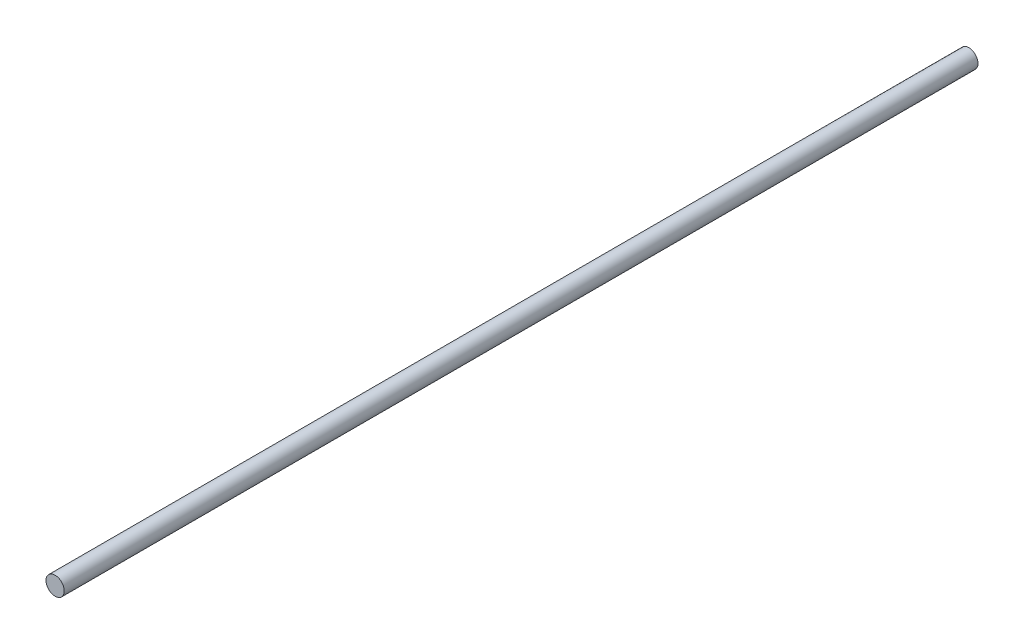
ISO-10303-21;
HEADER;
FILE_DESCRIPTION(('STEP AP214'),'2;1');
FILE_NAME('part.step','',(''),(''),'','','');
FILE_SCHEMA(('AUTOMOTIVE_DESIGN { 1 0 10303 214 1 1 1 1 }'));
ENDSEC;
DATA;
#1=APPLICATION_CONTEXT('core data for automotive mechanical design processes');
#2=APPLICATION_PROTOCOL_DEFINITION('international standard','automotive_design',2000,#1);
#3=PRODUCT_CONTEXT('',#1,'mechanical');
#4=PRODUCT('Part','Part','',(#3));
#5=PRODUCT_RELATED_PRODUCT_CATEGORY('part','',(#4));
#6=PRODUCT_DEFINITION_FORMATION('','',#4);
#7=PRODUCT_DEFINITION_CONTEXT('part definition',#1,'design');
#8=PRODUCT_DEFINITION('design','',#6,#7);
#9=PRODUCT_DEFINITION_SHAPE('','',#8);
#10=(LENGTH_UNIT() NAMED_UNIT(*) SI_UNIT(.MILLI.,.METRE.));
#11=(NAMED_UNIT(*) PLANE_ANGLE_UNIT() SI_UNIT($,.RADIAN.));
#12=(NAMED_UNIT(*) SI_UNIT($,.STERADIAN.) SOLID_ANGLE_UNIT());
#13=UNCERTAINTY_MEASURE_WITH_UNIT(LENGTH_MEASURE(1.E-05),#10,'distance_accuracy_value','');
#14=(GEOMETRIC_REPRESENTATION_CONTEXT(3) GLOBAL_UNCERTAINTY_ASSIGNED_CONTEXT((#13)) GLOBAL_UNIT_ASSIGNED_CONTEXT((#10,
#11,#12)) REPRESENTATION_CONTEXT('',''));
#15=CARTESIAN_POINT('',(0.,0.,0.));
#16=DIRECTION('',(0.,0.,1.));
#17=DIRECTION('',(1.,0.,0.));
#18=AXIS2_PLACEMENT_3D('',#15,#16,#17);
#19=CARTESIAN_POINT('',(0.,0.,100.));
#20=DIRECTION('',(0.,0.,-1.));
#21=DIRECTION('',(-1.,0.,0.));
#22=AXIS2_PLACEMENT_3D('',#19,#20,#21);
#23=CYLINDRICAL_SURFACE('',#22,1.);
#24=CARTESIAN_POINT('',(0.,0.,100.));
#25=DIRECTION('',(0.,0.,1.));
#26=DIRECTION('',(1.,0.,0.));
#27=AXIS2_PLACEMENT_3D('',#24,#25,#26);
#28=CIRCLE('',#27,1.);
#29=CARTESIAN_POINT('',(1.,0.,100.));
#30=VERTEX_POINT('',#29);
#31=EDGE_CURVE('E10',#30,#30,#28,.T.);
#32=ORIENTED_EDGE('',*,*,#31,.F.);
#33=EDGE_LOOP('',(#32));
#34=FACE_BOUND('',#33,.T.);
#35=CARTESIAN_POINT('',(0.,0.,0.));
#36=DIRECTION('',(0.,0.,1.));
#37=DIRECTION('',(1.,0.,0.));
#38=AXIS2_PLACEMENT_3D('',#35,#36,#37);
#39=CIRCLE('',#38,1.);
#40=CARTESIAN_POINT('',(1.,0.,0.));
#41=VERTEX_POINT('',#40);
#42=EDGE_CURVE('E33',#41,#41,#39,.T.);
#43=ORIENTED_EDGE('',*,*,#42,.T.);
#44=EDGE_LOOP('',(#43));
#45=FACE_BOUND('',#44,.T.);
#46=ADVANCED_FACE('F30',(#34,#45),#23,.T.);
#47=CARTESIAN_POINT('',(0.,0.,100.));
#48=DIRECTION('',(0.,0.,1.));
#49=DIRECTION('',(1.,0.,0.));
#50=AXIS2_PLACEMENT_3D('',#47,#48,#49);
#51=PLANE('',#50);
#52=ORIENTED_EDGE('',*,*,#31,.T.);
#53=EDGE_LOOP('',(#52));
#54=FACE_BOUND('',#53,.T.);
#55=ADVANCED_FACE('F45',(#54),#51,.T.);
#56=CARTESIAN_POINT('',(0.,0.,0.));
#57=DIRECTION('',(0.,0.,1.));
#58=DIRECTION('',(1.,0.,0.));
#59=AXIS2_PLACEMENT_3D('',#56,#57,#58);
#60=PLANE('',#59);
#61=ORIENTED_EDGE('',*,*,#42,.F.);
#62=EDGE_LOOP('',(#61));
#63=FACE_BOUND('',#62,.T.);
#64=ADVANCED_FACE('F43',(#63),#60,.F.);
#65=CLOSED_SHELL('',(#46,#55,#64));
#66=MANIFOLD_SOLID_BREP('B2',#65);
#67=ADVANCED_BREP_SHAPE_REPRESENTATION('',(#18,#66),#14);
#68=SHAPE_DEFINITION_REPRESENTATION(#9,#67);
ENDSEC;
END-ISO-10303-21;
